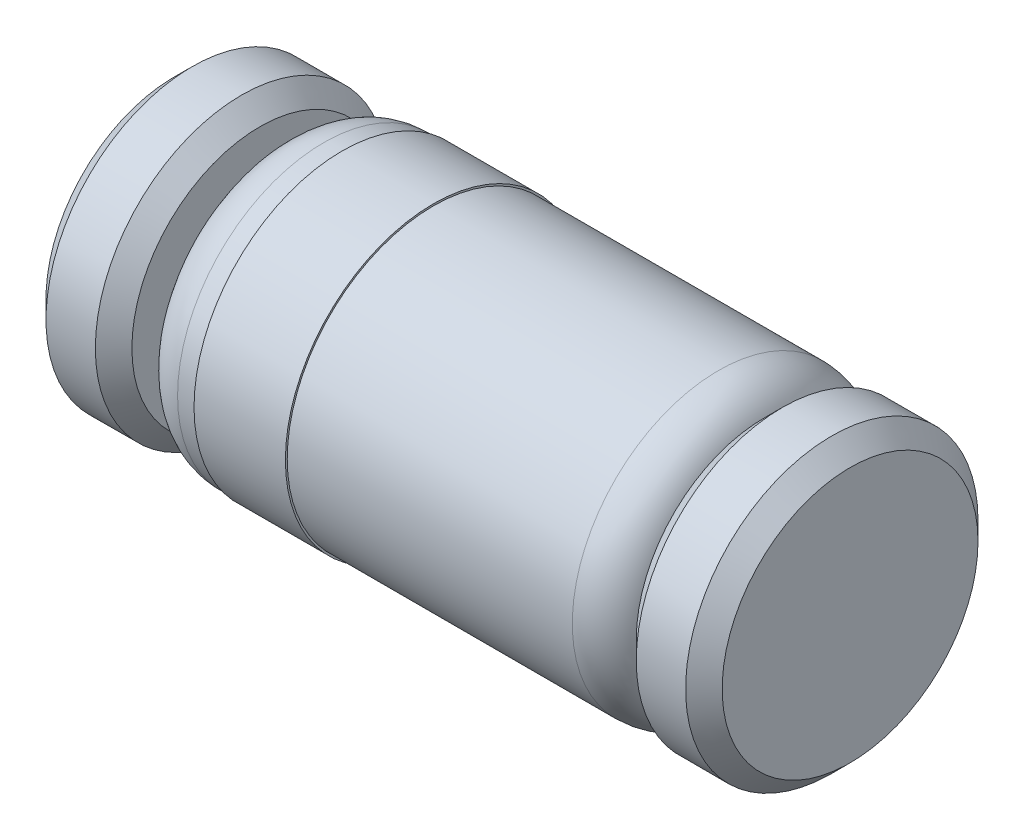
ISO-10303-21;
HEADER;
FILE_DESCRIPTION(('STEP AP214'),'2;1');
FILE_NAME('part.step','',(''),(''),'','','');
FILE_SCHEMA(('AUTOMOTIVE_DESIGN { 1 0 10303 214 1 1 1 1 }'));
ENDSEC;
DATA;
#1=APPLICATION_CONTEXT('core data for automotive mechanical design processes');
#2=APPLICATION_PROTOCOL_DEFINITION('international standard','automotive_design',2000,#1);
#3=PRODUCT_CONTEXT('',#1,'mechanical');
#4=PRODUCT('Part','Part','',(#3));
#5=PRODUCT_RELATED_PRODUCT_CATEGORY('part','',(#4));
#6=PRODUCT_DEFINITION_FORMATION('','',#4);
#7=PRODUCT_DEFINITION_CONTEXT('part definition',#1,'design');
#8=PRODUCT_DEFINITION('design','',#6,#7);
#9=PRODUCT_DEFINITION_SHAPE('','',#8);
#10=(LENGTH_UNIT() NAMED_UNIT(*) SI_UNIT(.MILLI.,.METRE.));
#11=(NAMED_UNIT(*) PLANE_ANGLE_UNIT() SI_UNIT($,.RADIAN.));
#12=(NAMED_UNIT(*) SI_UNIT($,.STERADIAN.) SOLID_ANGLE_UNIT());
#13=UNCERTAINTY_MEASURE_WITH_UNIT(LENGTH_MEASURE(1.E-05),#10,'distance_accuracy_value','');
#14=(GEOMETRIC_REPRESENTATION_CONTEXT(3) GLOBAL_UNCERTAINTY_ASSIGNED_CONTEXT((#13)) GLOBAL_UNIT_ASSIGNED_CONTEXT((#10,
#11,#12)) REPRESENTATION_CONTEXT('',''));
#15=CARTESIAN_POINT('',(0.,0.,0.));
#16=DIRECTION('',(0.,0.,1.));
#17=DIRECTION('',(1.,0.,0.));
#18=AXIS2_PLACEMENT_3D('',#15,#16,#17);
#19=CARTESIAN_POINT('',(0.,0.,0.));
#20=DIRECTION('',(1.,0.,0.));
#21=DIRECTION('',(0.,0.,-1.));
#22=AXIS2_PLACEMENT_3D('',#19,#20,#21);
#23=PLANE('',#22);
#24=CARTESIAN_POINT('',(0.,0.,0.));
#25=DIRECTION('',(1.,0.,0.));
#26=DIRECTION('',(0.,0.,-1.));
#27=AXIS2_PLACEMENT_3D('',#24,#25,#26);
#28=CIRCLE('',#27,0.7);
#29=CARTESIAN_POINT('',(0.,0.,-0.7));
#30=VERTEX_POINT('',#29);
#31=EDGE_CURVE('E73',#30,#30,#28,.T.);
#32=ORIENTED_EDGE('',*,*,#31,.T.);
#33=EDGE_LOOP('',(#32));
#34=FACE_BOUND('',#33,.T.);
#35=ADVANCED_FACE('F53',(#34),#23,.T.);
#36=CARTESIAN_POINT('',(-0.47,0.,0.));
#37=DIRECTION('',(-1.,0.,0.));
#38=DIRECTION('',(0.,0.,1.));
#39=AXIS2_PLACEMENT_3D('',#36,#37,#38);
#40=PLANE('',#39);
#41=CARTESIAN_POINT('',(-0.47,0.,0.));
#42=DIRECTION('',(-1.,0.,0.));
#43=DIRECTION('',(0.,0.,1.));
#44=AXIS2_PLACEMENT_3D('',#41,#42,#43);
#45=CIRCLE('',#44,0.699999999999999);
#46=CARTESIAN_POINT('',(-0.47,0.,0.699999999999999));
#47=VERTEX_POINT('',#46);
#48=EDGE_CURVE('E11',#47,#47,#45,.T.);
#49=ORIENTED_EDGE('',*,*,#48,.T.);
#50=EDGE_LOOP('',(#49));
#51=FACE_BOUND('',#50,.T.);
#52=ADVANCED_FACE('F89',(#51),#40,.T.);
#53=CARTESIAN_POINT('',(0.,0.,0.));
#54=DIRECTION('',(1.,0.,0.));
#55=DIRECTION('',(0.,0.,-1.));
#56=AXIS2_PLACEMENT_3D('',#53,#54,#55);
#57=CYLINDRICAL_SURFACE('',#56,0.8);
#58=CARTESIAN_POINT('',(-0.100000000000001,0.,0.));
#59=DIRECTION('',(1.,0.,0.));
#60=DIRECTION('',(0.,0.,-1.));
#61=AXIS2_PLACEMENT_3D('',#58,#59,#60);
#62=CIRCLE('',#61,0.8);
#63=CARTESIAN_POINT('',(-0.100000000000001,0.,-0.8));
#64=VERTEX_POINT('',#63);
#65=EDGE_CURVE('E62',#64,#64,#62,.F.);
#66=ORIENTED_EDGE('',*,*,#65,.T.);
#67=EDGE_LOOP('',(#66));
#68=FACE_BOUND('',#67,.T.);
#69=CARTESIAN_POINT('',(-0.37,0.,0.));
#70=DIRECTION('',(-1.,0.,0.));
#71=DIRECTION('',(0.,0.,1.));
#72=AXIS2_PLACEMENT_3D('',#69,#70,#71);
#73=CIRCLE('',#72,0.8);
#74=CARTESIAN_POINT('',(-0.37,0.,0.8));
#75=VERTEX_POINT('',#74);
#76=EDGE_CURVE('E68',#75,#75,#73,.F.);
#77=ORIENTED_EDGE('',*,*,#76,.T.);
#78=EDGE_LOOP('',(#77));
#79=FACE_BOUND('',#78,.T.);
#80=ADVANCED_FACE('F82',(#68,#79),#57,.T.);
#81=CARTESIAN_POINT('',(0.,0.,0.));
#82=DIRECTION('',(-1.,0.,0.));
#83=DIRECTION('',(0.,0.,1.));
#84=AXIS2_PLACEMENT_3D('',#81,#82,#83);
#85=CONICAL_SURFACE('',#84,0.7,0.785398163397447);
#86=ORIENTED_EDGE('',*,*,#65,.F.);
#87=EDGE_LOOP('',(#86));
#88=FACE_BOUND('',#87,.T.);
#89=ORIENTED_EDGE('',*,*,#31,.F.);
#90=EDGE_LOOP('',(#89));
#91=FACE_BOUND('',#90,.T.);
#92=ADVANCED_FACE('F80',(#88,#91),#85,.T.);
#93=CARTESIAN_POINT('',(-0.37,0.,0.));
#94=DIRECTION('',(1.,0.,0.));
#95=DIRECTION('',(0.,0.,-1.));
#96=AXIS2_PLACEMENT_3D('',#93,#94,#95);
#97=CONICAL_SURFACE('',#96,0.8,0.785398163397451);
#98=ORIENTED_EDGE('',*,*,#48,.F.);
#99=EDGE_LOOP('',(#98));
#100=FACE_BOUND('',#99,.T.);
#101=ORIENTED_EDGE('',*,*,#76,.F.);
#102=EDGE_LOOP('',(#101));
#103=FACE_BOUND('',#102,.T.);
#104=ADVANCED_FACE('F56',(#100,#103),#97,.T.);
#105=CLOSED_SHELL('',(#35,#52,#80,#92,#104));
#106=MANIFOLD_SOLID_BREP('B2',#105);
#107=CARTESIAN_POINT('',(0.,0.,0.));
#108=DIRECTION('',(1.,0.,0.));
#109=DIRECTION('',(0.,0.,-1.));
#110=AXIS2_PLACEMENT_3D('',#107,#108,#109);
#111=CYLINDRICAL_SURFACE('',#110,0.8);
#112=CARTESIAN_POINT('',(-2.88,0.,0.));
#113=DIRECTION('',(-1.,0.,0.));
#114=DIRECTION('',(0.,0.,1.));
#115=AXIS2_PLACEMENT_3D('',#112,#113,#114);
#116=CIRCLE('',#115,0.8);
#117=CARTESIAN_POINT('',(-2.88,0.,0.8));
#118=VERTEX_POINT('',#117);
#119=EDGE_CURVE('E270',#118,#118,#116,.F.);
#120=ORIENTED_EDGE('',*,*,#119,.T.);
#121=EDGE_LOOP('',(#120));
#122=FACE_BOUND('',#121,.T.);
#123=CARTESIAN_POINT('',(-2.78,0.,0.));
#124=DIRECTION('',(-1.,0.,0.));
#125=DIRECTION('',(0.,0.,1.));
#126=AXIS2_PLACEMENT_3D('',#123,#124,#125);
#127=CIRCLE('',#126,0.8);
#128=CARTESIAN_POINT('',(-2.78,0.,0.8));
#129=VERTEX_POINT('',#128);
#130=EDGE_CURVE('E254',#129,#129,#127,.T.);
#131=ORIENTED_EDGE('',*,*,#130,.T.);
#132=EDGE_LOOP('',(#131));
#133=FACE_BOUND('',#132,.T.);
#134=ADVANCED_FACE('F139',(#122,#133),#111,.T.);
#135=CARTESIAN_POINT('',(-3.23,0.,0.));
#136=DIRECTION('',(-1.,0.,0.));
#137=DIRECTION('',(0.,0.,1.));
#138=AXIS2_PLACEMENT_3D('',#135,#136,#137);
#139=PLANE('',#138);
#140=CARTESIAN_POINT('',(-3.23,0.,0.));
#141=DIRECTION('',(1.,0.,0.));
#142=DIRECTION('',(0.,0.,-1.));
#143=AXIS2_PLACEMENT_3D('',#140,#141,#142);
#144=CIRCLE('',#143,0.4);
#145=CARTESIAN_POINT('',(-3.23,0.,-0.4));
#146=VERTEX_POINT('',#145);
#147=EDGE_CURVE('E52',#146,#146,#144,.T.);
#148=ORIENTED_EDGE('',*,*,#147,.F.);
#149=EDGE_LOOP('',(#148));
#150=FACE_BOUND('',#149,.T.);
#151=CARTESIAN_POINT('',(-3.23,0.,0.));
#152=DIRECTION('',(-1.,0.,0.));
#153=DIRECTION('',(0.,0.,1.));
#154=AXIS2_PLACEMENT_3D('',#151,#152,#153);
#155=CIRCLE('',#154,0.699999999999999);
#156=CARTESIAN_POINT('',(-3.23,0.,0.7));
#157=VERTEX_POINT('',#156);
#158=EDGE_CURVE('E144',#157,#157,#155,.F.);
#159=ORIENTED_EDGE('',*,*,#158,.T.);
#160=EDGE_LOOP('',(#159));
#161=FACE_BOUND('',#160,.T.);
#162=ADVANCED_FACE('F196',(#150,#161),#139,.F.);
#163=CARTESIAN_POINT('',(-3.7,0.,0.));
#164=DIRECTION('',(1.,0.,0.));
#165=DIRECTION('',(0.,0.,-1.));
#166=AXIS2_PLACEMENT_3D('',#163,#164,#165);
#167=PLANE('',#166);
#168=CARTESIAN_POINT('',(-3.7,0.,0.));
#169=DIRECTION('',(1.,0.,0.));
#170=DIRECTION('',(0.,0.,-1.));
#171=AXIS2_PLACEMENT_3D('',#168,#169,#170);
#172=CIRCLE('',#171,0.699999999999998);
#173=CARTESIAN_POINT('',(-3.7,0.,-0.699999999999997));
#174=VERTEX_POINT('',#173);
#175=EDGE_CURVE('E156',#174,#174,#172,.F.);
#176=ORIENTED_EDGE('',*,*,#175,.T.);
#177=EDGE_LOOP('',(#176));
#178=FACE_BOUND('',#177,.T.);
#179=ADVANCED_FACE('F178',(#178),#167,.F.);
#180=CARTESIAN_POINT('',(0.,0.,0.));
#181=DIRECTION('',(1.,0.,0.));
#182=DIRECTION('',(0.,0.,-1.));
#183=AXIS2_PLACEMENT_3D('',#180,#181,#182);
#184=CYLINDRICAL_SURFACE('',#183,0.8);
#185=CARTESIAN_POINT('',(-3.6,0.,0.));
#186=DIRECTION('',(1.,0.,0.));
#187=DIRECTION('',(0.,0.,-1.));
#188=AXIS2_PLACEMENT_3D('',#185,#186,#187);
#189=CIRCLE('',#188,0.8);
#190=CARTESIAN_POINT('',(-3.6,0.,-0.799999999999999));
#191=VERTEX_POINT('',#190);
#192=EDGE_CURVE('E169',#191,#191,#189,.T.);
#193=ORIENTED_EDGE('',*,*,#192,.T.);
#194=EDGE_LOOP('',(#193));
#195=FACE_BOUND('',#194,.T.);
#196=CARTESIAN_POINT('',(-3.33,0.,0.));
#197=DIRECTION('',(-1.,0.,0.));
#198=DIRECTION('',(0.,0.,1.));
#199=AXIS2_PLACEMENT_3D('',#196,#197,#198);
#200=CIRCLE('',#199,0.8);
#201=CARTESIAN_POINT('',(-3.33,0.,0.8));
#202=VERTEX_POINT('',#201);
#203=EDGE_CURVE('E165',#202,#202,#200,.T.);
#204=ORIENTED_EDGE('',*,*,#203,.T.);
#205=EDGE_LOOP('',(#204));
#206=FACE_BOUND('',#205,.T.);
#207=ADVANCED_FACE('F183',(#195,#206),#184,.T.);
#208=CARTESIAN_POINT('',(-3.6,0.,0.));
#209=DIRECTION('',(1.,0.,0.));
#210=DIRECTION('',(0.,0.,-1.));
#211=AXIS2_PLACEMENT_3D('',#208,#209,#210);
#212=CONICAL_SURFACE('',#211,0.8,0.78539816339745);
#213=ORIENTED_EDGE('',*,*,#175,.F.);
#214=EDGE_LOOP('',(#213));
#215=FACE_BOUND('',#214,.T.);
#216=ORIENTED_EDGE('',*,*,#192,.F.);
#217=EDGE_LOOP('',(#216));
#218=FACE_BOUND('',#217,.T.);
#219=ADVANCED_FACE('F180',(#215,#218),#212,.T.);
#220=CARTESIAN_POINT('',(-3.23,0.,0.));
#221=DIRECTION('',(-1.,0.,0.));
#222=DIRECTION('',(0.,0.,1.));
#223=AXIS2_PLACEMENT_3D('',#220,#221,#222);
#224=CONICAL_SURFACE('',#223,0.699999999999999,0.785398163397445);
#225=ORIENTED_EDGE('',*,*,#203,.F.);
#226=EDGE_LOOP('',(#225));
#227=FACE_BOUND('',#226,.T.);
#228=ORIENTED_EDGE('',*,*,#158,.F.);
#229=EDGE_LOOP('',(#228));
#230=FACE_BOUND('',#229,.T.);
#231=ADVANCED_FACE('F142',(#227,#230),#224,.T.);
#232=CARTESIAN_POINT('',(0.,0.,0.));
#233=DIRECTION('',(1.,0.,0.));
#234=DIRECTION('',(0.,0.,-1.));
#235=AXIS2_PLACEMENT_3D('',#232,#233,#234);
#236=CYLINDRICAL_SURFACE('',#235,0.4);
#237=ORIENTED_EDGE('',*,*,#147,.T.);
#238=EDGE_LOOP('',(#237));
#239=FACE_BOUND('',#238,.T.);
#240=CARTESIAN_POINT('',(-3.13,0.,0.));
#241=DIRECTION('',(1.,0.,0.));
#242=DIRECTION('',(0.,0.,-1.));
#243=AXIS2_PLACEMENT_3D('',#240,#241,#242);
#244=CIRCLE('',#243,0.4);
#245=CARTESIAN_POINT('',(-3.13,0.,-0.4));
#246=VERTEX_POINT('',#245);
#247=EDGE_CURVE('E161',#246,#246,#244,.T.);
#248=ORIENTED_EDGE('',*,*,#247,.F.);
#249=EDGE_LOOP('',(#248));
#250=FACE_BOUND('',#249,.T.);
#251=ADVANCED_FACE('F193',(#239,#250),#236,.T.);
#252=CARTESIAN_POINT('',(-3.13,0.,0.));
#253=DIRECTION('',(-1.,0.,0.));
#254=DIRECTION('',(0.,0.,1.));
#255=AXIS2_PLACEMENT_3D('',#252,#253,#254);
#256=PLANE('',#255);
#257=ORIENTED_EDGE('',*,*,#247,.T.);
#258=EDGE_LOOP('',(#257));
#259=FACE_BOUND('',#258,.T.);
#260=CARTESIAN_POINT('',(-3.13,0.,0.));
#261=DIRECTION('',(-1.,0.,0.));
#262=DIRECTION('',(0.,0.,1.));
#263=AXIS2_PLACEMENT_3D('',#260,#261,#262);
#264=CIRCLE('',#263,0.55);
#265=CARTESIAN_POINT('',(-3.13,0.,0.55));
#266=VERTEX_POINT('',#265);
#267=EDGE_CURVE('E159',#266,#266,#264,.T.);
#268=ORIENTED_EDGE('',*,*,#267,.T.);
#269=EDGE_LOOP('',(#268));
#270=FACE_BOUND('',#269,.T.);
#271=ADVANCED_FACE('F216',(#259,#270),#256,.T.);
#272=CARTESIAN_POINT('',(-2.88,0.,0.));
#273=DIRECTION('',(-1.,0.,0.));
#274=DIRECTION('',(0.,0.,1.));
#275=AXIS2_PLACEMENT_3D('',#272,#273,#274);
#276=TOROIDAL_SURFACE('',#275,0.55,0.25);
#277=ORIENTED_EDGE('',*,*,#267,.F.);
#278=EDGE_LOOP('',(#277));
#279=FACE_BOUND('',#278,.T.);
#280=ORIENTED_EDGE('',*,*,#119,.F.);
#281=EDGE_LOOP('',(#280));
#282=FACE_BOUND('',#281,.T.);
#283=ADVANCED_FACE('F217',(#279,#282),#276,.T.);
#284=CARTESIAN_POINT('',(-2.78,0.,-0.8));
#285=DIRECTION('',(1.,0.,0.));
#286=DIRECTION('',(0.,0.,-1.));
#287=AXIS2_PLACEMENT_3D('',#284,#285,#286);
#288=PLANE('',#287);
#289=ORIENTED_EDGE('',*,*,#130,.F.);
#290=EDGE_LOOP('',(#289));
#291=FACE_BOUND('',#290,.T.);
#292=CARTESIAN_POINT('',(-2.78,0.,0.));
#293=DIRECTION('',(-1.,0.,0.));
#294=DIRECTION('',(0.,0.,1.));
#295=AXIS2_PLACEMENT_3D('',#292,#293,#294);
#296=CIRCLE('',#295,0.81);
#297=CARTESIAN_POINT('',(-2.78,0.,0.81));
#298=VERTEX_POINT('',#297);
#299=EDGE_CURVE('E258',#298,#298,#296,.T.);
#300=ORIENTED_EDGE('',*,*,#299,.T.);
#301=EDGE_LOOP('',(#300));
#302=FACE_BOUND('',#301,.T.);
#303=ADVANCED_FACE('F220',(#291,#302),#288,.F.);
#304=CARTESIAN_POINT('',(-3.7,0.,0.));
#305=DIRECTION('',(-1.,0.,0.));
#306=DIRECTION('',(0.,0.,1.));
#307=AXIS2_PLACEMENT_3D('',#304,#305,#306);
#308=CYLINDRICAL_SURFACE('',#307,0.81);
#309=ORIENTED_EDGE('',*,*,#299,.F.);
#310=EDGE_LOOP('',(#309));
#311=FACE_BOUND('',#310,.T.);
#312=CARTESIAN_POINT('',(-2.28,0.,0.));
#313=DIRECTION('',(-1.,0.,0.));
#314=DIRECTION('',(0.,0.,1.));
#315=AXIS2_PLACEMENT_3D('',#312,#313,#314);
#316=CIRCLE('',#315,0.81);
#317=CARTESIAN_POINT('',(-2.28,0.,0.81));
#318=VERTEX_POINT('',#317);
#319=EDGE_CURVE('E248',#318,#318,#316,.T.);
#320=ORIENTED_EDGE('',*,*,#319,.T.);
#321=EDGE_LOOP('',(#320));
#322=FACE_BOUND('',#321,.T.);
#323=ADVANCED_FACE('F236',(#311,#322),#308,.T.);
#324=CARTESIAN_POINT('',(-2.28,0.,-0.8));
#325=DIRECTION('',(-1.,0.,0.));
#326=DIRECTION('',(0.,0.,1.));
#327=AXIS2_PLACEMENT_3D('',#324,#325,#326);
#328=PLANE('',#327);
#329=ORIENTED_EDGE('',*,*,#319,.F.);
#330=EDGE_LOOP('',(#329));
#331=FACE_BOUND('',#330,.T.);
#332=CARTESIAN_POINT('',(-2.28,0.,0.));
#333=DIRECTION('',(-1.,0.,0.));
#334=DIRECTION('',(0.,0.,1.));
#335=AXIS2_PLACEMENT_3D('',#332,#333,#334);
#336=CIRCLE('',#335,0.8);
#337=CARTESIAN_POINT('',(-2.28,0.,0.8));
#338=VERTEX_POINT('',#337);
#339=EDGE_CURVE('E251',#338,#338,#336,.T.);
#340=ORIENTED_EDGE('',*,*,#339,.T.);
#341=EDGE_LOOP('',(#340));
#342=FACE_BOUND('',#341,.T.);
#343=ADVANCED_FACE('F228',(#331,#342),#328,.F.);
#344=CARTESIAN_POINT('',(-0.47,0.,0.));
#345=DIRECTION('',(1.,0.,0.));
#346=DIRECTION('',(0.,0.,-1.));
#347=AXIS2_PLACEMENT_3D('',#344,#345,#346);
#348=PLANE('',#347);
#349=CARTESIAN_POINT('',(-0.47,0.,0.));
#350=DIRECTION('',(1.,0.,0.));
#351=DIRECTION('',(0.,0.,-1.));
#352=AXIS2_PLACEMENT_3D('',#349,#350,#351);
#353=CIRCLE('',#352,0.55);
#354=CARTESIAN_POINT('',(-0.47,0.,-0.55));
#355=VERTEX_POINT('',#354);
#356=EDGE_CURVE('E267',#355,#355,#353,.T.);
#357=ORIENTED_EDGE('',*,*,#356,.T.);
#358=EDGE_LOOP('',(#357));
#359=FACE_BOUND('',#358,.T.);
#360=ADVANCED_FACE('F225',(#359),#348,.T.);
#361=CARTESIAN_POINT('',(-0.72,0.,0.));
#362=DIRECTION('',(1.,0.,0.));
#363=DIRECTION('',(0.,0.,-1.));
#364=AXIS2_PLACEMENT_3D('',#361,#362,#363);
#365=TOROIDAL_SURFACE('',#364,0.55,0.25);
#366=CARTESIAN_POINT('',(-0.72,0.,0.));
#367=DIRECTION('',(1.,0.,0.));
#368=DIRECTION('',(0.,0.,-1.));
#369=AXIS2_PLACEMENT_3D('',#366,#367,#368);
#370=CIRCLE('',#369,0.8);
#371=CARTESIAN_POINT('',(-0.72,0.,-0.8));
#372=VERTEX_POINT('',#371);
#373=EDGE_CURVE('E273',#372,#372,#370,.F.);
#374=ORIENTED_EDGE('',*,*,#373,.F.);
#375=EDGE_LOOP('',(#374));
#376=FACE_BOUND('',#375,.T.);
#377=ORIENTED_EDGE('',*,*,#356,.F.);
#378=EDGE_LOOP('',(#377));
#379=FACE_BOUND('',#378,.T.);
#380=ADVANCED_FACE('F222',(#376,#379),#365,.T.);
#381=ORIENTED_EDGE('',*,*,#373,.T.);
#382=EDGE_LOOP('',(#381));
#383=FACE_BOUND('',#382,.T.);
#384=ORIENTED_EDGE('',*,*,#339,.F.);
#385=EDGE_LOOP('',(#384));
#386=FACE_BOUND('',#385,.T.);
#387=ADVANCED_FACE('F207',(#383,#386),#111,.T.);
#388=CLOSED_SHELL('',(#134,#162,#179,#207,#219,#231,#251,#271,#283,#303,#323,#343,#360,#380,#387));
#389=MANIFOLD_SOLID_BREP('B6',#388);
#390=ADVANCED_BREP_SHAPE_REPRESENTATION('',(#18,#106,#389),#14);
#391=SHAPE_DEFINITION_REPRESENTATION(#9,#390);
ENDSEC;
END-ISO-10303-21;
